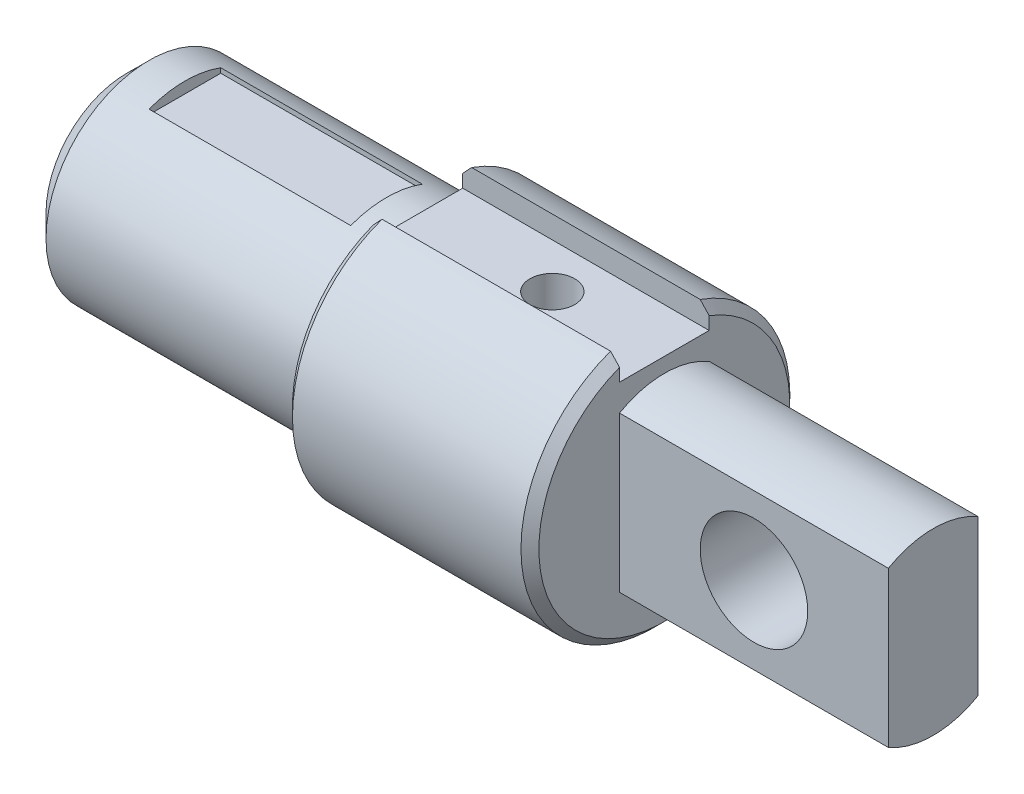
ISO-10303-21;
HEADER;
FILE_DESCRIPTION(('STEP AP214'),'2;1');
FILE_NAME('part.step','',(''),(''),'','','');
FILE_SCHEMA(('AUTOMOTIVE_DESIGN { 1 0 10303 214 1 1 1 1 }'));
ENDSEC;
DATA;
#1=APPLICATION_CONTEXT('core data for automotive mechanical design processes');
#2=APPLICATION_PROTOCOL_DEFINITION('international standard','automotive_design',2000,#1);
#3=PRODUCT_CONTEXT('',#1,'mechanical');
#4=PRODUCT('Part','Part','',(#3));
#5=PRODUCT_RELATED_PRODUCT_CATEGORY('part','',(#4));
#6=PRODUCT_DEFINITION_FORMATION('','',#4);
#7=PRODUCT_DEFINITION_CONTEXT('part definition',#1,'design');
#8=PRODUCT_DEFINITION('design','',#6,#7);
#9=PRODUCT_DEFINITION_SHAPE('','',#8);
#10=(LENGTH_UNIT() NAMED_UNIT(*) SI_UNIT(.MILLI.,.METRE.));
#11=(NAMED_UNIT(*) PLANE_ANGLE_UNIT() SI_UNIT($,.RADIAN.));
#12=(NAMED_UNIT(*) SI_UNIT($,.STERADIAN.) SOLID_ANGLE_UNIT());
#13=UNCERTAINTY_MEASURE_WITH_UNIT(LENGTH_MEASURE(1.E-05),#10,'distance_accuracy_value','');
#14=(GEOMETRIC_REPRESENTATION_CONTEXT(3) GLOBAL_UNCERTAINTY_ASSIGNED_CONTEXT((#13)) GLOBAL_UNIT_ASSIGNED_CONTEXT((#10,
#11,#12)) REPRESENTATION_CONTEXT('',''));
#15=CARTESIAN_POINT('',(0.,0.,0.));
#16=DIRECTION('',(0.,0.,1.));
#17=DIRECTION('',(1.,0.,0.));
#18=AXIS2_PLACEMENT_3D('',#15,#16,#17);
#19=CARTESIAN_POINT('',(0.,0.,0.));
#20=DIRECTION('',(1.,0.,0.));
#21=DIRECTION('',(0.,0.,-1.));
#22=AXIS2_PLACEMENT_3D('',#19,#20,#21);
#23=CYLINDRICAL_SURFACE('',#22,20.);
#24=CARTESIAN_POINT('',(180.,0.,0.));
#25=DIRECTION('',(1.,0.,0.));
#26=DIRECTION('',(0.,0.,-1.));
#27=AXIS2_PLACEMENT_3D('',#24,#25,#26);
#28=CIRCLE('',#27,20.);
#29=CARTESIAN_POINT('',(180.,17.3205080756888,-10.));
#30=VERTEX_POINT('',#29);
#31=CARTESIAN_POINT('',(180.,17.3205080756888,10.));
#32=VERTEX_POINT('',#31);
#33=EDGE_CURVE('E376',#30,#32,#28,.T.);
#34=ORIENTED_EDGE('',*,*,#33,.F.);
#35=DIRECTION('',(-1.,0.,0.));
#36=VECTOR('',#35,1.);
#37=CARTESIAN_POINT('',(653.108646422186,17.3205080756888,-10.));
#38=LINE('',#37,#36);
#39=CARTESIAN_POINT('',(120.,17.3205080756888,-10.));
#40=VERTEX_POINT('',#39);
#41=EDGE_CURVE('E181',#30,#40,#38,.T.);
#42=ORIENTED_EDGE('',*,*,#41,.T.);
#43=CARTESIAN_POINT('',(120.,0.,0.));
#44=DIRECTION('',(1.,0.,0.));
#45=DIRECTION('',(0.,0.,-1.));
#46=AXIS2_PLACEMENT_3D('',#43,#44,#45);
#47=CIRCLE('',#46,20.);
#48=CARTESIAN_POINT('',(120.,17.3205080756888,10.));
#49=VERTEX_POINT('',#48);
#50=EDGE_CURVE('E166',#40,#49,#47,.T.);
#51=ORIENTED_EDGE('',*,*,#50,.T.);
#52=DIRECTION('',(-1.,0.,0.));
#53=VECTOR('',#52,1.);
#54=CARTESIAN_POINT('',(653.108646422186,17.3205080756888,10.));
#55=LINE('',#54,#53);
#56=EDGE_CURVE('E388',#32,#49,#55,.T.);
#57=ORIENTED_EDGE('',*,*,#56,.F.);
#58=EDGE_LOOP('',(#34,#42,#51,#57));
#59=FACE_BOUND('',#58,.T.);
#60=ADVANCED_FACE('F51',(#59),#23,.T.);
#61=CARTESIAN_POINT('',(120.,-17.3205080756888,10.));
#62=VERTEX_POINT('',#61);
#63=CARTESIAN_POINT('',(120.,-17.3205080756888,-10.));
#64=VERTEX_POINT('',#63);
#65=EDGE_CURVE('E164',#62,#64,#47,.T.);
#66=ORIENTED_EDGE('',*,*,#65,.T.);
#67=DIRECTION('',(-1.,0.,0.));
#68=VECTOR('',#67,1.);
#69=CARTESIAN_POINT('',(653.108646422186,-17.3205080756888,-10.));
#70=LINE('',#69,#68);
#71=CARTESIAN_POINT('',(180.,-17.3205080756888,-10.));
#72=VERTEX_POINT('',#71);
#73=EDGE_CURVE('E170',#72,#64,#70,.T.);
#74=ORIENTED_EDGE('',*,*,#73,.F.);
#75=CARTESIAN_POINT('',(180.,-17.3205080756888,10.));
#76=VERTEX_POINT('',#75);
#77=EDGE_CURVE('E194',#76,#72,#28,.T.);
#78=ORIENTED_EDGE('',*,*,#77,.F.);
#79=DIRECTION('',(-1.,0.,0.));
#80=VECTOR('',#79,1.);
#81=CARTESIAN_POINT('',(653.108646422186,-17.3205080756888,10.));
#82=LINE('',#81,#80);
#83=EDGE_CURVE('E185',#76,#62,#82,.T.);
#84=ORIENTED_EDGE('',*,*,#83,.T.);
#85=EDGE_LOOP('',(#66,#74,#78,#84));
#86=FACE_BOUND('',#85,.T.);
#87=ADVANCED_FACE('F183',(#86),#23,.T.);
#88=CARTESIAN_POINT('',(180.,20.,0.));
#89=DIRECTION('',(1.,0.,0.));
#90=DIRECTION('',(0.,0.,-1.));
#91=AXIS2_PLACEMENT_3D('',#88,#89,#90);
#92=PLANE('',#91);
#93=ORIENTED_EDGE('',*,*,#77,.T.);
#94=DIRECTION('',(0.,-1.,0.));
#95=VECTOR('',#94,1.);
#96=CARTESIAN_POINT('',(180.,17.3205080756888,-10.));
#97=LINE('',#96,#95);
#98=EDGE_CURVE('E176',#30,#72,#97,.T.);
#99=ORIENTED_EDGE('',*,*,#98,.F.);
#100=ORIENTED_EDGE('',*,*,#33,.T.);
#101=DIRECTION('',(0.,-1.,0.));
#102=VECTOR('',#101,1.);
#103=CARTESIAN_POINT('',(180.,17.3205080756888,10.));
#104=LINE('',#103,#102);
#105=EDGE_CURVE('E382',#32,#76,#104,.T.);
#106=ORIENTED_EDGE('',*,*,#105,.T.);
#107=EDGE_LOOP('',(#93,#99,#100,#106));
#108=FACE_BOUND('',#107,.T.);
#109=ADVANCED_FACE('F298',(#108),#92,.T.);
#110=CARTESIAN_POINT('',(0.,0.,0.));
#111=DIRECTION('',(-1.,0.,0.));
#112=DIRECTION('',(0.,0.,1.));
#113=AXIS2_PLACEMENT_3D('',#110,#111,#112);
#114=PLANE('',#113);
#115=CARTESIAN_POINT('',(0.,0.,0.));
#116=DIRECTION('',(-1.,0.,0.));
#117=DIRECTION('',(0.,0.,1.));
#118=AXIS2_PLACEMENT_3D('',#115,#116,#117);
#119=CIRCLE('',#118,17.9999999999999);
#120=CARTESIAN_POINT('',(0.,0.,17.9999999999999));
#121=VERTEX_POINT('',#120);
#122=EDGE_CURVE('E230',#121,#121,#119,.T.);
#123=ORIENTED_EDGE('',*,*,#122,.T.);
#124=EDGE_LOOP('',(#123));
#125=FACE_BOUND('',#124,.T.);
#126=ADVANCED_FACE('F294',(#125),#114,.T.);
#127=CARTESIAN_POINT('',(0.,0.,0.));
#128=DIRECTION('',(1.,0.,0.));
#129=DIRECTION('',(0.,0.,-1.));
#130=AXIS2_PLACEMENT_3D('',#127,#128,#129);
#131=CYLINDRICAL_SURFACE('',#130,23.);
#132=CARTESIAN_POINT('',(5.00000000000003,0.,0.));
#133=DIRECTION('',(-1.,0.,0.));
#134=DIRECTION('',(0.,0.,1.));
#135=AXIS2_PLACEMENT_3D('',#132,#133,#134);
#136=CIRCLE('',#135,23.);
#137=CARTESIAN_POINT('',(5.00000000000003,0.,23.));
#138=VERTEX_POINT('',#137);
#139=EDGE_CURVE('E222',#138,#138,#136,.F.);
#140=ORIENTED_EDGE('',*,*,#139,.T.);
#141=EDGE_LOOP('',(#140));
#142=FACE_BOUND('',#141,.T.);
#143=DIRECTION('',(1.,0.,0.));
#144=VECTOR('',#143,1.);
#145=CARTESIAN_POINT('',(0.,21.5638586528478,-8.));
#146=LINE('',#145,#144);
#147=CARTESIAN_POINT('',(13.,21.5638586528478,-8.));
#148=VERTEX_POINT('',#147);
#149=CARTESIAN_POINT('',(58.,21.5638586528478,-8.));
#150=VERTEX_POINT('',#149);
#151=EDGE_CURVE('E207',#148,#150,#146,.T.);
#152=ORIENTED_EDGE('',*,*,#151,.T.);
#153=CARTESIAN_POINT('',(58.,0.,0.));
#154=DIRECTION('',(1.,0.,0.));
#155=DIRECTION('',(0.,0.,-1.));
#156=AXIS2_PLACEMENT_3D('',#153,#154,#155);
#157=CIRCLE('',#156,23.);
#158=CARTESIAN_POINT('',(58.,21.5638586528478,8.));
#159=VERTEX_POINT('',#158);
#160=EDGE_CURVE('E200',#159,#150,#157,.F.);
#161=ORIENTED_EDGE('',*,*,#160,.F.);
#162=DIRECTION('',(1.,0.,0.));
#163=VECTOR('',#162,1.);
#164=CARTESIAN_POINT('',(0.,21.5638586528478,8.));
#165=LINE('',#164,#163);
#166=CARTESIAN_POINT('',(13.,21.5638586528478,8.));
#167=VERTEX_POINT('',#166);
#168=EDGE_CURVE('E192',#167,#159,#165,.T.);
#169=ORIENTED_EDGE('',*,*,#168,.F.);
#170=CARTESIAN_POINT('',(13.,0.,0.));
#171=DIRECTION('',(-1.,0.,0.));
#172=DIRECTION('',(0.,0.,1.));
#173=AXIS2_PLACEMENT_3D('',#170,#171,#172);
#174=CIRCLE('',#173,23.);
#175=EDGE_CURVE('E203',#148,#167,#174,.F.);
#176=ORIENTED_EDGE('',*,*,#175,.F.);
#177=EDGE_LOOP('',(#152,#161,#169,#176));
#178=FACE_BOUND('',#177,.T.);
#179=CARTESIAN_POINT('',(65.,0.,0.));
#180=DIRECTION('',(1.,0.,0.));
#181=DIRECTION('',(0.,0.,-1.));
#182=AXIS2_PLACEMENT_3D('',#179,#180,#181);
#183=CIRCLE('',#182,23.);
#184=CARTESIAN_POINT('',(65.,0.,-23.));
#185=VERTEX_POINT('',#184);
#186=EDGE_CURVE('E187',#185,#185,#183,.T.);
#187=ORIENTED_EDGE('',*,*,#186,.F.);
#188=EDGE_LOOP('',(#187));
#189=FACE_BOUND('',#188,.T.);
#190=ADVANCED_FACE('F297',(#142,#178,#189),#131,.T.);
#191=CARTESIAN_POINT('',(65.,23.,0.));
#192=DIRECTION('',(-1.,0.,0.));
#193=DIRECTION('',(0.,0.,1.));
#194=AXIS2_PLACEMENT_3D('',#191,#192,#193);
#195=PLANE('',#194);
#196=DIRECTION('',(0.,-1.,0.));
#197=VECTOR('',#196,1.);
#198=CARTESIAN_POINT('',(65.,23.2842712474619,-10.));
#199=LINE('',#198,#197);
#200=CARTESIAN_POINT('',(65.,26.1533936612441,-10.));
#201=VERTEX_POINT('',#200);
#202=CARTESIAN_POINT('',(65.,23.2842712474619,-10.));
#203=VERTEX_POINT('',#202);
#204=EDGE_CURVE('E409',#201,#203,#199,.T.);
#205=ORIENTED_EDGE('',*,*,#204,.F.);
#206=CARTESIAN_POINT('',(65.,0.,0.));
#207=DIRECTION('',(-1.,0.,0.));
#208=DIRECTION('',(0.,0.,1.));
#209=AXIS2_PLACEMENT_3D('',#206,#207,#208);
#210=CIRCLE('',#209,28.);
#211=CARTESIAN_POINT('',(65.,26.1533936612441,10.));
#212=VERTEX_POINT('',#211);
#213=EDGE_CURVE('E13',#201,#212,#210,.T.);
#214=ORIENTED_EDGE('',*,*,#213,.T.);
#215=DIRECTION('',(0.,1.,0.));
#216=VECTOR('',#215,1.);
#217=CARTESIAN_POINT('',(65.,23.2842712474619,10.));
#218=LINE('',#217,#216);
#219=CARTESIAN_POINT('',(65.,23.2842712474619,10.));
#220=VERTEX_POINT('',#219);
#221=EDGE_CURVE('E406',#220,#212,#218,.T.);
#222=ORIENTED_EDGE('',*,*,#221,.F.);
#223=DIRECTION('',(0.,0.,1.));
#224=VECTOR('',#223,1.);
#225=CARTESIAN_POINT('',(65.,23.2842712474619,-10.));
#226=LINE('',#225,#224);
#227=EDGE_CURVE('E412',#203,#220,#226,.T.);
#228=ORIENTED_EDGE('',*,*,#227,.F.);
#229=EDGE_LOOP('',(#205,#214,#222,#228));
#230=FACE_BOUND('',#229,.T.);
#231=ORIENTED_EDGE('',*,*,#186,.T.);
#232=EDGE_LOOP('',(#231));
#233=FACE_BOUND('',#232,.T.);
#234=ADVANCED_FACE('F302',(#230,#233),#195,.T.);
#235=CARTESIAN_POINT('',(0.,0.,0.));
#236=DIRECTION('',(1.,0.,0.));
#237=DIRECTION('',(0.,0.,-1.));
#238=AXIS2_PLACEMENT_3D('',#235,#236,#237);
#239=CYLINDRICAL_SURFACE('',#238,30.);
#240=DIRECTION('',(1.,0.,0.));
#241=VECTOR('',#240,1.);
#242=CARTESIAN_POINT('',(0.,28.2842712474619,-10.));
#243=LINE('',#242,#241);
#244=CARTESIAN_POINT('',(118.,28.2842712474619,-10.));
#245=VERTEX_POINT('',#244);
#246=CARTESIAN_POINT('',(67.,28.2842712474619,-10.));
#247=VERTEX_POINT('',#246);
#248=EDGE_CURVE('E420',#245,#247,#243,.F.);
#249=ORIENTED_EDGE('',*,*,#248,.F.);
#250=CARTESIAN_POINT('',(118.,0.,0.));
#251=DIRECTION('',(1.,0.,0.));
#252=DIRECTION('',(0.,0.,-1.));
#253=AXIS2_PLACEMENT_3D('',#250,#251,#252);
#254=CIRCLE('',#253,30.);
#255=CARTESIAN_POINT('',(118.,28.2842712474619,10.));
#256=VERTEX_POINT('',#255);
#257=EDGE_CURVE('E74',#245,#256,#254,.F.);
#258=ORIENTED_EDGE('',*,*,#257,.T.);
#259=DIRECTION('',(1.,0.,0.));
#260=VECTOR('',#259,1.);
#261=CARTESIAN_POINT('',(0.,28.2842712474619,10.));
#262=LINE('',#261,#260);
#263=CARTESIAN_POINT('',(67.,28.2842712474619,10.));
#264=VERTEX_POINT('',#263);
#265=EDGE_CURVE('E366',#264,#256,#262,.T.);
#266=ORIENTED_EDGE('',*,*,#265,.F.);
#267=CARTESIAN_POINT('',(67.,0.,0.));
#268=DIRECTION('',(-1.,0.,0.));
#269=DIRECTION('',(0.,0.,1.));
#270=AXIS2_PLACEMENT_3D('',#267,#268,#269);
#271=CIRCLE('',#270,30.);
#272=EDGE_CURVE('E438',#264,#247,#271,.F.);
#273=ORIENTED_EDGE('',*,*,#272,.T.);
#274=EDGE_LOOP('',(#249,#258,#266,#273));
#275=FACE_BOUND('',#274,.T.);
#276=ADVANCED_FACE('F306',(#275),#239,.T.);
#277=CARTESIAN_POINT('',(120.,30.,0.));
#278=DIRECTION('',(1.,0.,0.));
#279=DIRECTION('',(0.,0.,-1.));
#280=AXIS2_PLACEMENT_3D('',#277,#278,#279);
#281=PLANE('',#280);
#282=DIRECTION('',(0.,-1.,0.));
#283=VECTOR('',#282,1.);
#284=CARTESIAN_POINT('',(120.,30.,10.));
#285=LINE('',#284,#283);
#286=CARTESIAN_POINT('',(120.,26.1533936612441,10.));
#287=VERTEX_POINT('',#286);
#288=CARTESIAN_POINT('',(120.,23.2842712474619,10.));
#289=VERTEX_POINT('',#288);
#290=EDGE_CURVE('E219',#287,#289,#285,.T.);
#291=ORIENTED_EDGE('',*,*,#290,.F.);
#292=CARTESIAN_POINT('',(120.,0.,0.));
#293=DIRECTION('',(1.,0.,0.));
#294=DIRECTION('',(0.,0.,-1.));
#295=AXIS2_PLACEMENT_3D('',#292,#293,#294);
#296=CIRCLE('',#295,28.);
#297=CARTESIAN_POINT('',(120.,26.1533936612441,-10.));
#298=VERTEX_POINT('',#297);
#299=EDGE_CURVE('E234',#287,#298,#296,.T.);
#300=ORIENTED_EDGE('',*,*,#299,.T.);
#301=DIRECTION('',(0.,1.,0.));
#302=VECTOR('',#301,1.);
#303=CARTESIAN_POINT('',(120.,30.,-10.));
#304=LINE('',#303,#302);
#305=CARTESIAN_POINT('',(120.,23.2842712474619,-10.));
#306=VERTEX_POINT('',#305);
#307=EDGE_CURVE('E211',#306,#298,#304,.T.);
#308=ORIENTED_EDGE('',*,*,#307,.F.);
#309=DIRECTION('',(0.,0.,-1.));
#310=VECTOR('',#309,1.);
#311=CARTESIAN_POINT('',(120.,23.2842712474619,0.));
#312=LINE('',#311,#310);
#313=EDGE_CURVE('E215',#289,#306,#312,.T.);
#314=ORIENTED_EDGE('',*,*,#313,.F.);
#315=EDGE_LOOP('',(#291,#300,#308,#314));
#316=FACE_BOUND('',#315,.T.);
#317=ORIENTED_EDGE('',*,*,#65,.F.);
#318=DIRECTION('',(0.,-1.,0.));
#319=VECTOR('',#318,1.);
#320=CARTESIAN_POINT('',(120.,17.3205080756888,10.));
#321=LINE('',#320,#319);
#322=EDGE_CURVE('E386',#49,#62,#321,.T.);
#323=ORIENTED_EDGE('',*,*,#322,.F.);
#324=ORIENTED_EDGE('',*,*,#50,.F.);
#325=DIRECTION('',(0.,-1.,0.));
#326=VECTOR('',#325,1.);
#327=CARTESIAN_POINT('',(120.,17.3205080756888,-10.));
#328=LINE('',#327,#326);
#329=EDGE_CURVE('E159',#40,#64,#328,.T.);
#330=ORIENTED_EDGE('',*,*,#329,.T.);
#331=EDGE_LOOP('',(#317,#323,#324,#330));
#332=FACE_BOUND('',#331,.T.);
#333=ADVANCED_FACE('F161',(#316,#332),#281,.T.);
#334=CARTESIAN_POINT('',(13.,23.,-8.));
#335=DIRECTION('',(-1.,0.,0.));
#336=DIRECTION('',(0.,0.,1.));
#337=AXIS2_PLACEMENT_3D('',#334,#335,#336);
#338=PLANE('',#337);
#339=DIRECTION('',(0.,-1.,0.));
#340=VECTOR('',#339,1.);
#341=CARTESIAN_POINT('',(13.,23.,-8.));
#342=LINE('',#341,#340);
#343=CARTESIAN_POINT('',(13.,20.5,-8.));
#344=VERTEX_POINT('',#343);
#345=EDGE_CURVE('E348',#148,#344,#342,.T.);
#346=ORIENTED_EDGE('',*,*,#345,.F.);
#347=ORIENTED_EDGE('',*,*,#175,.T.);
#348=DIRECTION('',(0.,-1.,0.));
#349=VECTOR('',#348,1.);
#350=CARTESIAN_POINT('',(13.,23.,8.));
#351=LINE('',#350,#349);
#352=CARTESIAN_POINT('',(13.,20.5,8.));
#353=VERTEX_POINT('',#352);
#354=EDGE_CURVE('E341',#167,#353,#351,.T.);
#355=ORIENTED_EDGE('',*,*,#354,.T.);
#356=DIRECTION('',(0.,0.,1.));
#357=VECTOR('',#356,1.);
#358=CARTESIAN_POINT('',(13.,20.5,-8.));
#359=LINE('',#358,#357);
#360=EDGE_CURVE('E358',#344,#353,#359,.T.);
#361=ORIENTED_EDGE('',*,*,#360,.F.);
#362=EDGE_LOOP('',(#346,#347,#355,#361));
#363=FACE_BOUND('',#362,.T.);
#364=ADVANCED_FACE('F311',(#363),#338,.F.);
#365=CARTESIAN_POINT('',(58.,23.,-8.));
#366=DIRECTION('',(1.,0.,0.));
#367=DIRECTION('',(0.,0.,-1.));
#368=AXIS2_PLACEMENT_3D('',#365,#366,#367);
#369=PLANE('',#368);
#370=ORIENTED_EDGE('',*,*,#160,.T.);
#371=DIRECTION('',(0.,1.,0.));
#372=VECTOR('',#371,1.);
#373=CARTESIAN_POINT('',(58.,23.,-8.));
#374=LINE('',#373,#372);
#375=CARTESIAN_POINT('',(58.,20.5,-8.));
#376=VERTEX_POINT('',#375);
#377=EDGE_CURVE('E356',#376,#150,#374,.T.);
#378=ORIENTED_EDGE('',*,*,#377,.F.);
#379=DIRECTION('',(0.,0.,1.));
#380=VECTOR('',#379,1.);
#381=CARTESIAN_POINT('',(58.,20.5,-8.));
#382=LINE('',#381,#380);
#383=CARTESIAN_POINT('',(58.,20.5,8.));
#384=VERTEX_POINT('',#383);
#385=EDGE_CURVE('E346',#376,#384,#382,.T.);
#386=ORIENTED_EDGE('',*,*,#385,.T.);
#387=DIRECTION('',(0.,1.,0.));
#388=VECTOR('',#387,1.);
#389=CARTESIAN_POINT('',(58.,23.,8.));
#390=LINE('',#389,#388);
#391=EDGE_CURVE('E339',#384,#159,#390,.T.);
#392=ORIENTED_EDGE('',*,*,#391,.T.);
#393=EDGE_LOOP('',(#370,#378,#386,#392));
#394=FACE_BOUND('',#393,.T.);
#395=ADVANCED_FACE('F321',(#394),#369,.F.);
#396=CARTESIAN_POINT('',(13.,20.5,-8.));
#397=DIRECTION('',(0.,-1.,0.));
#398=DIRECTION('',(0.,0.,-1.));
#399=AXIS2_PLACEMENT_3D('',#396,#397,#398);
#400=PLANE('',#399);
#401=DIRECTION('',(1.,0.,0.));
#402=VECTOR('',#401,1.);
#403=CARTESIAN_POINT('',(13.,20.5,8.));
#404=LINE('',#403,#402);
#405=EDGE_CURVE('E349',#353,#384,#404,.T.);
#406=ORIENTED_EDGE('',*,*,#405,.T.);
#407=ORIENTED_EDGE('',*,*,#385,.F.);
#408=DIRECTION('',(1.,0.,0.));
#409=VECTOR('',#408,1.);
#410=CARTESIAN_POINT('',(13.,20.5,-8.));
#411=LINE('',#410,#409);
#412=EDGE_CURVE('E361',#344,#376,#411,.T.);
#413=ORIENTED_EDGE('',*,*,#412,.F.);
#414=ORIENTED_EDGE('',*,*,#360,.T.);
#415=EDGE_LOOP('',(#406,#407,#413,#414));
#416=FACE_BOUND('',#415,.T.);
#417=ADVANCED_FACE('F323',(#416),#400,.F.);
#418=CARTESIAN_POINT('',(0.,0.,-8.));
#419=DIRECTION('',(0.,0.,1.));
#420=DIRECTION('',(1.,0.,0.));
#421=AXIS2_PLACEMENT_3D('',#418,#419,#420);
#422=PLANE('',#421);
#423=ORIENTED_EDGE('',*,*,#345,.T.);
#424=ORIENTED_EDGE('',*,*,#412,.T.);
#425=ORIENTED_EDGE('',*,*,#377,.T.);
#426=ORIENTED_EDGE('',*,*,#151,.F.);
#427=EDGE_LOOP('',(#423,#424,#425,#426));
#428=FACE_BOUND('',#427,.T.);
#429=ADVANCED_FACE('F268',(#428),#422,.T.);
#430=CARTESIAN_POINT('',(0.,0.,8.));
#431=DIRECTION('',(0.,0.,1.));
#432=DIRECTION('',(1.,0.,0.));
#433=AXIS2_PLACEMENT_3D('',#430,#431,#432);
#434=PLANE('',#433);
#435=ORIENTED_EDGE('',*,*,#168,.T.);
#436=ORIENTED_EDGE('',*,*,#391,.F.);
#437=ORIENTED_EDGE('',*,*,#405,.F.);
#438=ORIENTED_EDGE('',*,*,#354,.F.);
#439=EDGE_LOOP('',(#435,#436,#437,#438));
#440=FACE_BOUND('',#439,.T.);
#441=ADVANCED_FACE('F266',(#440),#434,.F.);
#442=CARTESIAN_POINT('',(180.,23.2842712474619,10.));
#443=DIRECTION('',(0.,0.,1.));
#444=DIRECTION('',(0.,-1.,0.));
#445=AXIS2_PLACEMENT_3D('',#442,#443,#444);
#446=PLANE('',#445);
#447=ORIENTED_EDGE('',*,*,#265,.T.);
#448=CARTESIAN_POINT('',(118.,28.2842712474619,10.));
#449=CARTESIAN_POINT('',(118.167064737936,28.1070720861429,10.));
#450=CARTESIAN_POINT('',(118.334037381811,27.9297860754182,10.));
#451=CARTESIAN_POINT('',(118.667787320959,27.5750307281957,10.));
#452=CARTESIAN_POINT('',(118.834564616497,27.3975613919462,10.));
#453=CARTESIAN_POINT('',(119.167913172306,27.0424292641719,10.));
#454=CARTESIAN_POINT('',(119.334484432551,26.8647664726219,10.));
#455=CARTESIAN_POINT('',(119.667408884056,26.5092362392939,10.));
#456=CARTESIAN_POINT('',(119.833762075021,26.3313687972394,10.));
#457=CARTESIAN_POINT('',(120.,26.1533936612441,10.));
#458=B_SPLINE_CURVE_WITH_KNOTS('',3,(#448,#449,#450,#451,#452,#453,#454,#455,#456,#457),
.UNSPECIFIED.,.F.,.F.,(4,2,2,2,4),(0.,0.730610368845186,1.46121974931528,2.19182922508272,
2.92243968931348),.UNSPECIFIED.);
#459=EDGE_CURVE('E61',#256,#287,#458,.T.);
#460=ORIENTED_EDGE('',*,*,#459,.T.);
#461=ORIENTED_EDGE('',*,*,#290,.T.);
#462=DIRECTION('',(-1.,0.,0.));
#463=VECTOR('',#462,1.);
#464=CARTESIAN_POINT('',(180.,23.2842712474619,10.));
#465=LINE('',#464,#463);
#466=EDGE_CURVE('E417',#289,#220,#465,.T.);
#467=ORIENTED_EDGE('',*,*,#466,.T.);
#468=ORIENTED_EDGE('',*,*,#221,.T.);
#469=CARTESIAN_POINT('',(65.,26.1533936612441,10.));
#470=CARTESIAN_POINT('',(65.1662379249792,26.3313687972394,10.));
#471=CARTESIAN_POINT('',(65.3325911159442,26.5092362392939,10.));
#472=CARTESIAN_POINT('',(65.665515567449,26.8647664726219,10.));
#473=CARTESIAN_POINT('',(65.8320868276936,27.0424292641719,10.));
#474=CARTESIAN_POINT('',(66.1654353835028,27.3975613919462,10.));
#475=CARTESIAN_POINT('',(66.3322126790405,27.5750307281957,10.));
#476=CARTESIAN_POINT('',(66.665962618189,27.9297860754182,10.));
#477=CARTESIAN_POINT('',(66.8329352620637,28.1070720861429,10.));
#478=CARTESIAN_POINT('',(67.,28.2842712474619,10.));
#479=B_SPLINE_CURVE_WITH_KNOTS('',3,(#469,#470,#471,#472,#473,#474,#475,#476,#477,#478),
.UNSPECIFIED.,.F.,.F.,(4,2,2,2,4),(0.,0.73061046423076,1.46121993999819,2.19182932046828,
2.92243968931347),.UNSPECIFIED.);
#480=EDGE_CURVE('E272',#212,#264,#479,.T.);
#481=ORIENTED_EDGE('',*,*,#480,.T.);
#482=EDGE_LOOP('',(#447,#460,#461,#467,#468,#481));
#483=FACE_BOUND('',#482,.T.);
#484=ADVANCED_FACE('F261',(#483),#446,.F.);
#485=CARTESIAN_POINT('',(180.,23.2842712474619,-10.));
#486=DIRECTION('',(0.,-1.,0.));
#487=DIRECTION('',(0.,0.,-1.));
#488=AXIS2_PLACEMENT_3D('',#485,#486,#487);
#489=PLANE('',#488);
#490=CARTESIAN_POINT('',(95.,23.2842712474619,0.));
#491=DIRECTION('',(0.,1.,0.));
#492=DIRECTION('',(0.,0.,1.));
#493=AXIS2_PLACEMENT_3D('',#490,#491,#492);
#494=CIRCLE('',#493,4.99999999999999);
#495=CARTESIAN_POINT('',(95.,23.2842712474619,4.99999999999999));
#496=VERTEX_POINT('',#495);
#497=EDGE_CURVE('E398',#496,#496,#494,.T.);
#498=ORIENTED_EDGE('',*,*,#497,.F.);
#499=EDGE_LOOP('',(#498));
#500=FACE_BOUND('',#499,.T.);
#501=ORIENTED_EDGE('',*,*,#313,.T.);
#502=DIRECTION('',(-1.,0.,0.));
#503=VECTOR('',#502,1.);
#504=CARTESIAN_POINT('',(180.,23.2842712474619,-10.));
#505=LINE('',#504,#503);
#506=EDGE_CURVE('E416',#306,#203,#505,.T.);
#507=ORIENTED_EDGE('',*,*,#506,.T.);
#508=ORIENTED_EDGE('',*,*,#227,.T.);
#509=ORIENTED_EDGE('',*,*,#466,.F.);
#510=EDGE_LOOP('',(#501,#507,#508,#509));
#511=FACE_BOUND('',#510,.T.);
#512=ADVANCED_FACE('F258',(#500,#511),#489,.F.);
#513=CARTESIAN_POINT('',(180.,23.2842712474619,-10.));
#514=DIRECTION('',(0.,0.,-1.));
#515=DIRECTION('',(0.,1.,0.));
#516=AXIS2_PLACEMENT_3D('',#513,#514,#515);
#517=PLANE('',#516);
#518=ORIENTED_EDGE('',*,*,#307,.T.);
#519=CARTESIAN_POINT('',(120.,26.1533936612441,-10.));
#520=CARTESIAN_POINT('',(119.833762075021,26.3313687972394,-10.));
#521=CARTESIAN_POINT('',(119.667408884056,26.5092362392939,-10.));
#522=CARTESIAN_POINT('',(119.334484432551,26.8647664726219,-10.));
#523=CARTESIAN_POINT('',(119.167913172306,27.0424292641719,-10.));
#524=CARTESIAN_POINT('',(118.834564616497,27.3975613919462,-10.));
#525=CARTESIAN_POINT('',(118.667787320959,27.5750307281957,-10.));
#526=CARTESIAN_POINT('',(118.334037381811,27.9297860754182,-10.));
#527=CARTESIAN_POINT('',(118.167064737936,28.1070720861429,-10.));
#528=CARTESIAN_POINT('',(118.,28.2842712474619,-10.));
#529=B_SPLINE_CURVE_WITH_KNOTS('',3,(#519,#520,#521,#522,#523,#524,#525,#526,#527,#528),
.UNSPECIFIED.,.F.,.F.,(4,2,2,2,4),(0.,0.730610464230772,1.46121993999821,2.1918293204683,
2.92243968931349),.UNSPECIFIED.);
#530=EDGE_CURVE('E246',#298,#245,#529,.T.);
#531=ORIENTED_EDGE('',*,*,#530,.T.);
#532=ORIENTED_EDGE('',*,*,#248,.T.);
#533=CARTESIAN_POINT('',(67.,28.2842712474619,-10.));
#534=CARTESIAN_POINT('',(66.8329352620637,28.1070720861429,-10.));
#535=CARTESIAN_POINT('',(66.665962618189,27.9297860754182,-10.));
#536=CARTESIAN_POINT('',(66.3322126790405,27.5750307281957,-10.));
#537=CARTESIAN_POINT('',(66.1654353835028,27.3975613919462,-10.));
#538=CARTESIAN_POINT('',(65.8320868276936,27.0424292641719,-10.));
#539=CARTESIAN_POINT('',(65.665515567449,26.8647664726219,-10.));
#540=CARTESIAN_POINT('',(65.3325911159442,26.5092362392939,-10.));
#541=CARTESIAN_POINT('',(65.1662379249792,26.3313687972394,-10.));
#542=CARTESIAN_POINT('',(65.,26.1533936612441,-10.));
#543=B_SPLINE_CURVE_WITH_KNOTS('',3,(#533,#534,#535,#536,#537,#538,#539,#540,#541,#542),
.UNSPECIFIED.,.F.,.F.,(4,2,2,2,4),(0.,0.730610368845186,1.46121974931528,2.19182922508271,
2.92243968931347),.UNSPECIFIED.);
#544=EDGE_CURVE('E238',#247,#201,#543,.T.);
#545=ORIENTED_EDGE('',*,*,#544,.T.);
#546=ORIENTED_EDGE('',*,*,#204,.T.);
#547=ORIENTED_EDGE('',*,*,#506,.F.);
#548=EDGE_LOOP('',(#518,#531,#532,#545,#546,#547));
#549=FACE_BOUND('',#548,.T.);
#550=ADVANCED_FACE('F252',(#549),#517,.F.);
#551=CARTESIAN_POINT('',(95.,-11.7157287525381,0.));
#552=DIRECTION('',(0.,1.,0.));
#553=DIRECTION('',(0.,0.,1.));
#554=AXIS2_PLACEMENT_3D('',#551,#552,#553);
#555=CONICAL_SURFACE('',#554,4.99999999999999,1.02974425867665);
#556=CARTESIAN_POINT('',(95.,-14.7200318476759,0.));
#557=VERTEX_POINT('',#556);
#558=VERTEX_LOOP('',#557);
#559=FACE_BOUND('',#558,.T.);
#560=CARTESIAN_POINT('',(95.,-11.7157287525381,0.));
#561=DIRECTION('',(0.,1.,0.));
#562=DIRECTION('',(0.,0.,1.));
#563=AXIS2_PLACEMENT_3D('',#560,#561,#562);
#564=CIRCLE('',#563,4.99999999999999);
#565=CARTESIAN_POINT('',(95.,-11.7157287525381,4.99999999999999));
#566=VERTEX_POINT('',#565);
#567=EDGE_CURVE('E402',#566,#566,#564,.T.);
#568=ORIENTED_EDGE('',*,*,#567,.T.);
#569=EDGE_LOOP('',(#568));
#570=FACE_BOUND('',#569,.T.);
#571=ADVANCED_FACE('F257',(#559,#570),#555,.F.);
#572=CARTESIAN_POINT('',(95.,23.2842712474619,0.));
#573=DIRECTION('',(0.,1.,0.));
#574=DIRECTION('',(0.,0.,1.));
#575=AXIS2_PLACEMENT_3D('',#572,#573,#574);
#576=CYLINDRICAL_SURFACE('',#575,4.99999999999999);
#577=ORIENTED_EDGE('',*,*,#567,.F.);
#578=EDGE_LOOP('',(#577));
#579=FACE_BOUND('',#578,.T.);
#580=ORIENTED_EDGE('',*,*,#497,.T.);
#581=EDGE_LOOP('',(#580));
#582=FACE_BOUND('',#581,.T.);
#583=ADVANCED_FACE('F480',(#579,#582),#576,.F.);
#584=CARTESIAN_POINT('',(653.108646422186,17.3205080756888,10.));
#585=DIRECTION('',(0.,0.,-1.));
#586=DIRECTION('',(-1.,0.,0.));
#587=AXIS2_PLACEMENT_3D('',#584,#585,#586);
#588=PLANE('',#587);
#589=CARTESIAN_POINT('',(150.,0.,10.));
#590=DIRECTION('',(0.,0.,1.));
#591=DIRECTION('',(1.,0.,0.));
#592=AXIS2_PLACEMENT_3D('',#589,#590,#591);
#593=CIRCLE('',#592,12.);
#594=CARTESIAN_POINT('',(162.,0.,10.));
#595=VERTEX_POINT('',#594);
#596=EDGE_CURVE('E226',#595,#595,#593,.T.);
#597=ORIENTED_EDGE('',*,*,#596,.F.);
#598=EDGE_LOOP('',(#597));
#599=FACE_BOUND('',#598,.T.);
#600=ORIENTED_EDGE('',*,*,#56,.T.);
#601=ORIENTED_EDGE('',*,*,#322,.T.);
#602=ORIENTED_EDGE('',*,*,#83,.F.);
#603=ORIENTED_EDGE('',*,*,#105,.F.);
#604=EDGE_LOOP('',(#600,#601,#602,#603));
#605=FACE_BOUND('',#604,.T.);
#606=ADVANCED_FACE('F385',(#599,#605),#588,.F.);
#607=CARTESIAN_POINT('',(653.108646422186,17.3205080756888,-10.));
#608=DIRECTION('',(0.,0.,-1.));
#609=DIRECTION('',(-1.,0.,0.));
#610=AXIS2_PLACEMENT_3D('',#607,#608,#609);
#611=PLANE('',#610);
#612=CARTESIAN_POINT('',(150.,0.,-10.));
#613=DIRECTION('',(0.,0.,-1.));
#614=DIRECTION('',(-1.,0.,0.));
#615=AXIS2_PLACEMENT_3D('',#612,#613,#614);
#616=CIRCLE('',#615,12.);
#617=CARTESIAN_POINT('',(138.,0.,-10.));
#618=VERTEX_POINT('',#617);
#619=EDGE_CURVE('E171',#618,#618,#616,.T.);
#620=ORIENTED_EDGE('',*,*,#619,.F.);
#621=EDGE_LOOP('',(#620));
#622=FACE_BOUND('',#621,.T.);
#623=ORIENTED_EDGE('',*,*,#41,.F.);
#624=ORIENTED_EDGE('',*,*,#98,.T.);
#625=ORIENTED_EDGE('',*,*,#73,.T.);
#626=ORIENTED_EDGE('',*,*,#329,.F.);
#627=EDGE_LOOP('',(#623,#624,#625,#626));
#628=FACE_BOUND('',#627,.T.);
#629=ADVANCED_FACE('F174',(#622,#628),#611,.T.);
#630=CARTESIAN_POINT('',(150.,0.,10.));
#631=DIRECTION('',(0.,0.,1.));
#632=DIRECTION('',(1.,0.,0.));
#633=AXIS2_PLACEMENT_3D('',#630,#631,#632);
#634=CYLINDRICAL_SURFACE('',#633,12.);
#635=ORIENTED_EDGE('',*,*,#619,.T.);
#636=EDGE_LOOP('',(#635));
#637=FACE_BOUND('',#636,.T.);
#638=ORIENTED_EDGE('',*,*,#596,.T.);
#639=EDGE_LOOP('',(#638));
#640=FACE_BOUND('',#639,.T.);
#641=ADVANCED_FACE('F292',(#637,#640),#634,.F.);
#642=CARTESIAN_POINT('',(5.00000000000003,0.,0.));
#643=DIRECTION('',(1.,0.,0.));
#644=DIRECTION('',(0.,0.,-1.));
#645=AXIS2_PLACEMENT_3D('',#642,#643,#644);
#646=CONICAL_SURFACE('',#645,23.,0.785398163397451);
#647=ORIENTED_EDGE('',*,*,#122,.F.);
#648=EDGE_LOOP('',(#647));
#649=FACE_BOUND('',#648,.T.);
#650=ORIENTED_EDGE('',*,*,#139,.F.);
#651=EDGE_LOOP('',(#650));
#652=FACE_BOUND('',#651,.T.);
#653=ADVANCED_FACE('F287',(#649,#652),#646,.T.);
#654=CARTESIAN_POINT('',(120.,0.,0.));
#655=DIRECTION('',(-1.,0.,0.));
#656=DIRECTION('',(0.,0.,1.));
#657=AXIS2_PLACEMENT_3D('',#654,#655,#656);
#658=CONICAL_SURFACE('',#657,28.,0.785398163397443);
#659=ORIENTED_EDGE('',*,*,#459,.F.);
#660=ORIENTED_EDGE('',*,*,#257,.F.);
#661=ORIENTED_EDGE('',*,*,#530,.F.);
#662=ORIENTED_EDGE('',*,*,#299,.F.);
#663=EDGE_LOOP('',(#659,#660,#661,#662));
#664=FACE_BOUND('',#663,.T.);
#665=ADVANCED_FACE('F283',(#664),#658,.T.);
#666=CARTESIAN_POINT('',(67.,0.,0.));
#667=DIRECTION('',(1.,0.,0.));
#668=DIRECTION('',(0.,0.,-1.));
#669=AXIS2_PLACEMENT_3D('',#666,#667,#668);
#670=CONICAL_SURFACE('',#669,30.,0.785398163397457);
#671=ORIENTED_EDGE('',*,*,#480,.F.);
#672=ORIENTED_EDGE('',*,*,#213,.F.);
#673=ORIENTED_EDGE('',*,*,#544,.F.);
#674=ORIENTED_EDGE('',*,*,#272,.F.);
#675=EDGE_LOOP('',(#671,#672,#673,#674));
#676=FACE_BOUND('',#675,.T.);
#677=ADVANCED_FACE('F53',(#676),#670,.T.);
#678=CLOSED_SHELL('',(#60,#87,#109,#126,#190,#234,#276,#333,#364,#395,#417,#429,#441,#484,#512,
#550,#571,#583,#606,#629,#641,#653,#665,#677));
#679=MANIFOLD_SOLID_BREP('B2',#678);
#680=ADVANCED_BREP_SHAPE_REPRESENTATION('',(#18,#679),#14);
#681=SHAPE_DEFINITION_REPRESENTATION(#9,#680);
ENDSEC;
END-ISO-10303-21;
